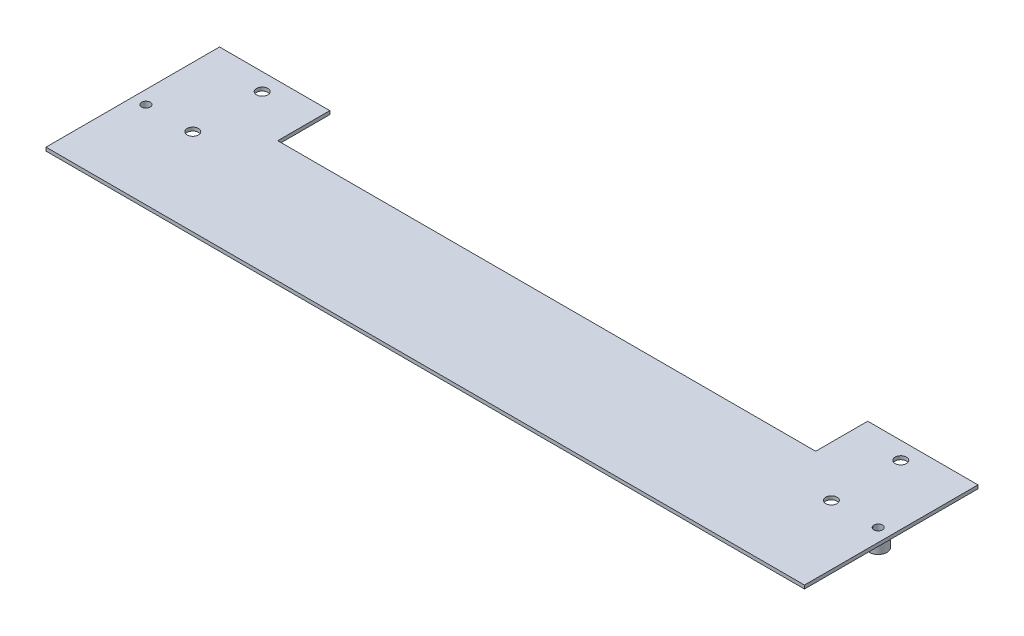
ISO-10303-21;
HEADER;
FILE_DESCRIPTION(('STEP AP214'),'2;1');
FILE_NAME('part.step','',(''),(''),'','','');
FILE_SCHEMA(('AUTOMOTIVE_DESIGN { 1 0 10303 214 1 1 1 1 }'));
ENDSEC;
DATA;
#1=APPLICATION_CONTEXT('core data for automotive mechanical design processes');
#2=APPLICATION_PROTOCOL_DEFINITION('international standard','automotive_design',2000,#1);
#3=PRODUCT_CONTEXT('',#1,'mechanical');
#4=PRODUCT('Part','Part','',(#3));
#5=PRODUCT_RELATED_PRODUCT_CATEGORY('part','',(#4));
#6=PRODUCT_DEFINITION_FORMATION('','',#4);
#7=PRODUCT_DEFINITION_CONTEXT('part definition',#1,'design');
#8=PRODUCT_DEFINITION('design','',#6,#7);
#9=PRODUCT_DEFINITION_SHAPE('','',#8);
#10=(LENGTH_UNIT() NAMED_UNIT(*) SI_UNIT(.MILLI.,.METRE.));
#11=(NAMED_UNIT(*) PLANE_ANGLE_UNIT() SI_UNIT($,.RADIAN.));
#12=(NAMED_UNIT(*) SI_UNIT($,.STERADIAN.) SOLID_ANGLE_UNIT());
#13=UNCERTAINTY_MEASURE_WITH_UNIT(LENGTH_MEASURE(1.E-05),#10,'distance_accuracy_value','');
#14=(GEOMETRIC_REPRESENTATION_CONTEXT(3) GLOBAL_UNCERTAINTY_ASSIGNED_CONTEXT((#13)) GLOBAL_UNIT_ASSIGNED_CONTEXT((#10,
#11,#12)) REPRESENTATION_CONTEXT('',''));
#15=CARTESIAN_POINT('',(0.,0.,0.));
#16=DIRECTION('',(0.,0.,1.));
#17=DIRECTION('',(1.,0.,0.));
#18=AXIS2_PLACEMENT_3D('',#15,#16,#17);
#19=CARTESIAN_POINT('',(193.5,2.,-50.));
#20=DIRECTION('',(0.,0.,1.));
#21=DIRECTION('',(1.,0.,0.));
#22=AXIS2_PLACEMENT_3D('',#19,#20,#21);
#23=PLANE('',#22);
#24=DIRECTION('',(0.,1.,0.));
#25=VECTOR('',#24,1.);
#26=CARTESIAN_POINT('',(-130.05,-16.9688637063127,-50.));
#27=LINE('',#26,#25);
#28=CARTESIAN_POINT('',(-130.05,0.,-50.));
#29=VERTEX_POINT('',#28);
#30=CARTESIAN_POINT('',(-130.05,2.,-50.));
#31=VERTEX_POINT('',#30);
#32=EDGE_CURVE('E164',#29,#31,#27,.T.);
#33=ORIENTED_EDGE('',*,*,#32,.F.);
#34=DIRECTION('',(-1.,0.,0.));
#35=VECTOR('',#34,1.);
#36=CARTESIAN_POINT('',(193.5,0.,-50.));
#37=LINE('',#36,#35);
#38=CARTESIAN_POINT('',(-193.6,0.,-50.));
#39=VERTEX_POINT('',#38);
#40=EDGE_CURVE('E154',#29,#39,#37,.T.);
#41=ORIENTED_EDGE('',*,*,#40,.T.);
#42=DIRECTION('',(0.,-1.,0.));
#43=VECTOR('',#42,1.);
#44=CARTESIAN_POINT('',(-193.6,2.,-50.));
#45=LINE('',#44,#43);
#46=CARTESIAN_POINT('',(-193.6,2.,-50.));
#47=VERTEX_POINT('',#46);
#48=EDGE_CURVE('E187',#47,#39,#45,.T.);
#49=ORIENTED_EDGE('',*,*,#48,.F.);
#50=DIRECTION('',(-1.,0.,0.));
#51=VECTOR('',#50,1.);
#52=CARTESIAN_POINT('',(193.5,2.,-50.));
#53=LINE('',#52,#51);
#54=EDGE_CURVE('E144',#31,#47,#53,.T.);
#55=ORIENTED_EDGE('',*,*,#54,.F.);
#56=EDGE_LOOP('',(#33,#41,#49,#55));
#57=FACE_BOUND('',#56,.T.);
#58=ADVANCED_FACE('F20',(#57),#23,.F.);
#59=CARTESIAN_POINT('',(0.,2.,0.));
#60=DIRECTION('',(0.,1.,0.));
#61=DIRECTION('',(0.,0.,1.));
#62=AXIS2_PLACEMENT_3D('',#59,#60,#61);
#63=PLANE('',#62);
#64=CARTESIAN_POINT('',(236.,2.,0.));
#65=DIRECTION('',(0.,1.,0.));
#66=DIRECTION('',(0.,0.,1.));
#67=AXIS2_PLACEMENT_3D('',#64,#65,#66);
#68=CIRCLE('',#67,2.4585);
#69=CARTESIAN_POINT('',(236.,2.,2.45849999999999));
#70=VERTEX_POINT('',#69);
#71=EDGE_CURVE('E114',#70,#70,#68,.F.);
#72=ORIENTED_EDGE('',*,*,#71,.T.);
#73=EDGE_LOOP('',(#72));
#74=FACE_BOUND('',#73,.T.);
#75=CARTESIAN_POINT('',(-186.008483751727,2.,0.));
#76=DIRECTION('',(0.,1.,0.));
#77=DIRECTION('',(0.,0.,1.));
#78=AXIS2_PLACEMENT_3D('',#75,#76,#77);
#79=CIRCLE('',#78,2.4585);
#80=CARTESIAN_POINT('',(-186.008483751727,2.,2.45849999999999));
#81=VERTEX_POINT('',#80);
#82=EDGE_CURVE('E163',#81,#81,#79,.F.);
#83=ORIENTED_EDGE('',*,*,#82,.T.);
#84=EDGE_LOOP('',(#83));
#85=FACE_BOUND('',#84,.T.);
#86=CARTESIAN_POINT('',(209.,2.,0.));
#87=DIRECTION('',(0.,-1.,0.));
#88=DIRECTION('',(-1.,0.,0.));
#89=AXIS2_PLACEMENT_3D('',#86,#87,#88);
#90=CIRCLE('',#89,3.25);
#91=CARTESIAN_POINT('',(205.75,2.,0.));
#92=VERTEX_POINT('',#91);
#93=EDGE_CURVE('E166',#92,#92,#90,.T.);
#94=ORIENTED_EDGE('',*,*,#93,.T.);
#95=EDGE_LOOP('',(#94));
#96=FACE_BOUND('',#95,.T.);
#97=CARTESIAN_POINT('',(209.,2.,-40.));
#98=DIRECTION('',(0.,-1.,0.));
#99=DIRECTION('',(-1.,0.,0.));
#100=AXIS2_PLACEMENT_3D('',#97,#98,#99);
#101=CIRCLE('',#100,3.25);
#102=CARTESIAN_POINT('',(205.75,2.,-40.));
#103=VERTEX_POINT('',#102);
#104=EDGE_CURVE('E205',#103,#103,#101,.T.);
#105=ORIENTED_EDGE('',*,*,#104,.T.);
#106=EDGE_LOOP('',(#105));
#107=FACE_BOUND('',#106,.T.);
#108=CARTESIAN_POINT('',(-159.008483751727,2.,0.));
#109=DIRECTION('',(0.,-1.,0.));
#110=DIRECTION('',(-1.,0.,0.));
#111=AXIS2_PLACEMENT_3D('',#108,#109,#110);
#112=CIRCLE('',#111,3.25);
#113=CARTESIAN_POINT('',(-162.258483751727,2.,0.));
#114=VERTEX_POINT('',#113);
#115=EDGE_CURVE('E178',#114,#114,#112,.T.);
#116=ORIENTED_EDGE('',*,*,#115,.T.);
#117=EDGE_LOOP('',(#116));
#118=FACE_BOUND('',#117,.T.);
#119=CARTESIAN_POINT('',(-159.008483751727,2.,-40.));
#120=DIRECTION('',(0.,-1.,0.));
#121=DIRECTION('',(1.,0.,0.));
#122=AXIS2_PLACEMENT_3D('',#119,#120,#121);
#123=CIRCLE('',#122,3.25);
#124=CARTESIAN_POINT('',(-155.758483751727,2.,-40.));
#125=VERTEX_POINT('',#124);
#126=EDGE_CURVE('E171',#125,#125,#123,.T.);
#127=ORIENTED_EDGE('',*,*,#126,.T.);
#128=EDGE_LOOP('',(#127));
#129=FACE_BOUND('',#128,.T.);
#130=DIRECTION('',(-1.,0.,0.));
#131=VECTOR('',#130,1.);
#132=CARTESIAN_POINT('',(-100.05,2.,-20.));
#133=LINE('',#132,#131);
#134=CARTESIAN_POINT('',(179.95,2.,-20.));
#135=VERTEX_POINT('',#134);
#136=CARTESIAN_POINT('',(-130.05,2.,-20.));
#137=VERTEX_POINT('',#136);
#138=EDGE_CURVE('E95',#135,#137,#133,.T.);
#139=ORIENTED_EDGE('',*,*,#138,.T.);
#140=DIRECTION('',(0.,0.,-1.));
#141=VECTOR('',#140,1.);
#142=CARTESIAN_POINT('',(-130.05,2.,-50.));
#143=LINE('',#142,#141);
#144=EDGE_CURVE('E101',#137,#31,#143,.T.);
#145=ORIENTED_EDGE('',*,*,#144,.T.);
#146=ORIENTED_EDGE('',*,*,#54,.T.);
#147=DIRECTION('',(0.,0.,1.));
#148=VECTOR('',#147,1.);
#149=CARTESIAN_POINT('',(-193.6,2.,-50.));
#150=LINE('',#149,#148);
#151=CARTESIAN_POINT('',(-193.6,2.,50.));
#152=VERTEX_POINT('',#151);
#153=EDGE_CURVE('E143',#47,#152,#150,.T.);
#154=ORIENTED_EDGE('',*,*,#153,.T.);
#155=DIRECTION('',(1.,0.,0.));
#156=VECTOR('',#155,1.);
#157=CARTESIAN_POINT('',(-193.5,2.,50.));
#158=LINE('',#157,#156);
#159=CARTESIAN_POINT('',(243.5,2.,50.));
#160=VERTEX_POINT('',#159);
#161=EDGE_CURVE('E145',#152,#160,#158,.T.);
#162=ORIENTED_EDGE('',*,*,#161,.T.);
#163=DIRECTION('',(0.,0.,-1.));
#164=VECTOR('',#163,1.);
#165=CARTESIAN_POINT('',(243.5,2.,50.));
#166=LINE('',#165,#164);
#167=CARTESIAN_POINT('',(243.5,2.,-50.));
#168=VERTEX_POINT('',#167);
#169=EDGE_CURVE('E148',#160,#168,#166,.T.);
#170=ORIENTED_EDGE('',*,*,#169,.T.);
#171=CARTESIAN_POINT('',(179.95,2.,-50.));
#172=VERTEX_POINT('',#171);
#173=EDGE_CURVE('E106',#168,#172,#53,.T.);
#174=ORIENTED_EDGE('',*,*,#173,.T.);
#175=DIRECTION('',(0.,0.,1.));
#176=VECTOR('',#175,1.);
#177=CARTESIAN_POINT('',(179.95,2.,-30.));
#178=LINE('',#177,#176);
#179=EDGE_CURVE('E85',#172,#135,#178,.T.);
#180=ORIENTED_EDGE('',*,*,#179,.T.);
#181=EDGE_LOOP('',(#139,#145,#146,#154,#162,#170,#174,#180));
#182=FACE_BOUND('',#181,.T.);
#183=ADVANCED_FACE('F104',(#74,#85,#96,#107,#118,#129,#182),#63,.T.);
#184=CARTESIAN_POINT('',(0.,0.,0.));
#185=DIRECTION('',(0.,1.,0.));
#186=DIRECTION('',(0.,0.,1.));
#187=AXIS2_PLACEMENT_3D('',#184,#185,#186);
#188=PLANE('',#187);
#189=CARTESIAN_POINT('',(236.,0.,0.));
#190=DIRECTION('',(0.,1.,0.));
#191=DIRECTION('',(-1.,0.,0.));
#192=AXIS2_PLACEMENT_3D('',#189,#190,#191);
#193=CIRCLE('',#192,5.);
#194=CARTESIAN_POINT('',(231.,0.,0.));
#195=VERTEX_POINT('',#194);
#196=EDGE_CURVE('E122',#195,#195,#193,.T.);
#197=ORIENTED_EDGE('',*,*,#196,.T.);
#198=EDGE_LOOP('',(#197));
#199=FACE_BOUND('',#198,.T.);
#200=CARTESIAN_POINT('',(-186.008483751727,0.,0.));
#201=DIRECTION('',(0.,1.,0.));
#202=DIRECTION('',(-1.,0.,0.));
#203=AXIS2_PLACEMENT_3D('',#200,#201,#202);
#204=CIRCLE('',#203,5.);
#205=CARTESIAN_POINT('',(-191.008483751727,0.,0.));
#206=VERTEX_POINT('',#205);
#207=EDGE_CURVE('E133',#206,#206,#204,.T.);
#208=ORIENTED_EDGE('',*,*,#207,.T.);
#209=EDGE_LOOP('',(#208));
#210=FACE_BOUND('',#209,.T.);
#211=CARTESIAN_POINT('',(-159.008483751727,0.,-40.));
#212=DIRECTION('',(0.,1.,0.));
#213=DIRECTION('',(0.,0.,1.));
#214=AXIS2_PLACEMENT_3D('',#211,#212,#213);
#215=CIRCLE('',#214,3.25);
#216=CARTESIAN_POINT('',(-159.008483751727,0.,-36.75));
#217=VERTEX_POINT('',#216);
#218=EDGE_CURVE('E159',#217,#217,#215,.F.);
#219=ORIENTED_EDGE('',*,*,#218,.F.);
#220=EDGE_LOOP('',(#219));
#221=FACE_BOUND('',#220,.T.);
#222=CARTESIAN_POINT('',(-159.008483751727,0.,0.));
#223=DIRECTION('',(0.,1.,0.));
#224=DIRECTION('',(0.,0.,1.));
#225=AXIS2_PLACEMENT_3D('',#222,#223,#224);
#226=CIRCLE('',#225,3.25);
#227=CARTESIAN_POINT('',(-159.008483751727,0.,3.24999999999996));
#228=VERTEX_POINT('',#227);
#229=EDGE_CURVE('E175',#228,#228,#226,.F.);
#230=ORIENTED_EDGE('',*,*,#229,.F.);
#231=EDGE_LOOP('',(#230));
#232=FACE_BOUND('',#231,.T.);
#233=CARTESIAN_POINT('',(209.,0.,-40.));
#234=DIRECTION('',(0.,1.,0.));
#235=DIRECTION('',(0.,0.,1.));
#236=AXIS2_PLACEMENT_3D('',#233,#234,#235);
#237=CIRCLE('',#236,3.25);
#238=CARTESIAN_POINT('',(209.,0.,-36.75));
#239=VERTEX_POINT('',#238);
#240=EDGE_CURVE('E182',#239,#239,#237,.F.);
#241=ORIENTED_EDGE('',*,*,#240,.F.);
#242=EDGE_LOOP('',(#241));
#243=FACE_BOUND('',#242,.T.);
#244=CARTESIAN_POINT('',(209.,0.,0.));
#245=DIRECTION('',(0.,1.,0.));
#246=DIRECTION('',(0.,0.,1.));
#247=AXIS2_PLACEMENT_3D('',#244,#245,#246);
#248=CIRCLE('',#247,3.25);
#249=CARTESIAN_POINT('',(209.,0.,3.24999999999999));
#250=VERTEX_POINT('',#249);
#251=EDGE_CURVE('E209',#250,#250,#248,.F.);
#252=ORIENTED_EDGE('',*,*,#251,.F.);
#253=EDGE_LOOP('',(#252));
#254=FACE_BOUND('',#253,.T.);
#255=DIRECTION('',(0.,0.,-1.));
#256=VECTOR('',#255,1.);
#257=CARTESIAN_POINT('',(-130.05,0.,0.));
#258=LINE('',#257,#256);
#259=CARTESIAN_POINT('',(-130.05,0.,-20.));
#260=VERTEX_POINT('',#259);
#261=EDGE_CURVE('E12',#260,#29,#258,.T.);
#262=ORIENTED_EDGE('',*,*,#261,.F.);
#263=DIRECTION('',(-1.,0.,0.));
#264=VECTOR('',#263,1.);
#265=CARTESIAN_POINT('',(0.,0.,-20.));
#266=LINE('',#265,#264);
#267=CARTESIAN_POINT('',(179.95,0.,-20.));
#268=VERTEX_POINT('',#267);
#269=EDGE_CURVE('E30',#268,#260,#266,.T.);
#270=ORIENTED_EDGE('',*,*,#269,.F.);
#271=DIRECTION('',(0.,0.,1.));
#272=VECTOR('',#271,1.);
#273=CARTESIAN_POINT('',(179.95,0.,0.));
#274=LINE('',#273,#272);
#275=CARTESIAN_POINT('',(179.95,0.,-50.));
#276=VERTEX_POINT('',#275);
#277=EDGE_CURVE('E88',#276,#268,#274,.T.);
#278=ORIENTED_EDGE('',*,*,#277,.F.);
#279=CARTESIAN_POINT('',(243.5,0.,-50.));
#280=VERTEX_POINT('',#279);
#281=EDGE_CURVE('E150',#280,#276,#37,.T.);
#282=ORIENTED_EDGE('',*,*,#281,.F.);
#283=DIRECTION('',(0.,0.,-1.));
#284=VECTOR('',#283,1.);
#285=CARTESIAN_POINT('',(243.5,0.,50.));
#286=LINE('',#285,#284);
#287=CARTESIAN_POINT('',(243.5,0.,50.));
#288=VERTEX_POINT('',#287);
#289=EDGE_CURVE('E158',#288,#280,#286,.T.);
#290=ORIENTED_EDGE('',*,*,#289,.F.);
#291=DIRECTION('',(1.,0.,0.));
#292=VECTOR('',#291,1.);
#293=CARTESIAN_POINT('',(-193.5,0.,50.));
#294=LINE('',#293,#292);
#295=CARTESIAN_POINT('',(-193.6,0.,50.));
#296=VERTEX_POINT('',#295);
#297=EDGE_CURVE('E155',#296,#288,#294,.T.);
#298=ORIENTED_EDGE('',*,*,#297,.F.);
#299=DIRECTION('',(0.,0.,1.));
#300=VECTOR('',#299,1.);
#301=CARTESIAN_POINT('',(-193.6,0.,-50.));
#302=LINE('',#301,#300);
#303=EDGE_CURVE('E149',#39,#296,#302,.T.);
#304=ORIENTED_EDGE('',*,*,#303,.F.);
#305=ORIENTED_EDGE('',*,*,#40,.F.);
#306=EDGE_LOOP('',(#262,#270,#278,#282,#290,#298,#304,#305));
#307=FACE_BOUND('',#306,.T.);
#308=ADVANCED_FACE('F220',(#199,#210,#221,#232,#243,#254,#307),#188,.F.);
#309=CARTESIAN_POINT('',(-193.6,2.,-50.));
#310=DIRECTION('',(1.,0.,0.));
#311=DIRECTION('',(0.,0.,-1.));
#312=AXIS2_PLACEMENT_3D('',#309,#310,#311);
#313=PLANE('',#312);
#314=ORIENTED_EDGE('',*,*,#303,.T.);
#315=DIRECTION('',(0.,-1.,0.));
#316=VECTOR('',#315,1.);
#317=CARTESIAN_POINT('',(-193.6,2.,50.));
#318=LINE('',#317,#316);
#319=EDGE_CURVE('E191',#152,#296,#318,.T.);
#320=ORIENTED_EDGE('',*,*,#319,.F.);
#321=ORIENTED_EDGE('',*,*,#153,.F.);
#322=ORIENTED_EDGE('',*,*,#48,.T.);
#323=EDGE_LOOP('',(#314,#320,#321,#322));
#324=FACE_BOUND('',#323,.T.);
#325=ADVANCED_FACE('F223',(#324),#313,.F.);
#326=ORIENTED_EDGE('',*,*,#281,.T.);
#327=DIRECTION('',(0.,1.,0.));
#328=VECTOR('',#327,1.);
#329=CARTESIAN_POINT('',(179.95,-16.9688637063127,-50.));
#330=LINE('',#329,#328);
#331=EDGE_CURVE('E92',#276,#172,#330,.T.);
#332=ORIENTED_EDGE('',*,*,#331,.T.);
#333=ORIENTED_EDGE('',*,*,#173,.F.);
#334=DIRECTION('',(0.,-1.,0.));
#335=VECTOR('',#334,1.);
#336=CARTESIAN_POINT('',(243.5,2.,-50.));
#337=LINE('',#336,#335);
#338=EDGE_CURVE('E190',#168,#280,#337,.T.);
#339=ORIENTED_EDGE('',*,*,#338,.T.);
#340=EDGE_LOOP('',(#326,#332,#333,#339));
#341=FACE_BOUND('',#340,.T.);
#342=ADVANCED_FACE('F266',(#341),#23,.F.);
#343=CARTESIAN_POINT('',(243.5,2.,50.));
#344=DIRECTION('',(-1.,0.,0.));
#345=DIRECTION('',(0.,0.,1.));
#346=AXIS2_PLACEMENT_3D('',#343,#344,#345);
#347=PLANE('',#346);
#348=ORIENTED_EDGE('',*,*,#289,.T.);
#349=ORIENTED_EDGE('',*,*,#338,.F.);
#350=ORIENTED_EDGE('',*,*,#169,.F.);
#351=DIRECTION('',(0.,-1.,0.));
#352=VECTOR('',#351,1.);
#353=CARTESIAN_POINT('',(243.5,2.,50.));
#354=LINE('',#353,#352);
#355=EDGE_CURVE('E199',#160,#288,#354,.T.);
#356=ORIENTED_EDGE('',*,*,#355,.T.);
#357=EDGE_LOOP('',(#348,#349,#350,#356));
#358=FACE_BOUND('',#357,.T.);
#359=ADVANCED_FACE('F272',(#358),#347,.F.);
#360=CARTESIAN_POINT('',(-193.5,2.,50.));
#361=DIRECTION('',(0.,0.,-1.));
#362=DIRECTION('',(-1.,0.,0.));
#363=AXIS2_PLACEMENT_3D('',#360,#361,#362);
#364=PLANE('',#363);
#365=ORIENTED_EDGE('',*,*,#297,.T.);
#366=ORIENTED_EDGE('',*,*,#355,.F.);
#367=ORIENTED_EDGE('',*,*,#161,.F.);
#368=ORIENTED_EDGE('',*,*,#319,.T.);
#369=EDGE_LOOP('',(#365,#366,#367,#368));
#370=FACE_BOUND('',#369,.T.);
#371=ADVANCED_FACE('F278',(#370),#364,.F.);
#372=CARTESIAN_POINT('',(-159.008483751727,-58.0429432254209,-40.));
#373=DIRECTION('',(0.,1.,0.));
#374=DIRECTION('',(0.,0.,1.));
#375=AXIS2_PLACEMENT_3D('',#372,#373,#374);
#376=CYLINDRICAL_SURFACE('',#375,3.25);
#377=ORIENTED_EDGE('',*,*,#126,.F.);
#378=EDGE_LOOP('',(#377));
#379=FACE_BOUND('',#378,.T.);
#380=ORIENTED_EDGE('',*,*,#218,.T.);
#381=EDGE_LOOP('',(#380));
#382=FACE_BOUND('',#381,.T.);
#383=ADVANCED_FACE('F286',(#379,#382),#376,.F.);
#384=CARTESIAN_POINT('',(-159.008483751727,-58.0429432254209,0.));
#385=DIRECTION('',(0.,1.,0.));
#386=DIRECTION('',(0.,0.,1.));
#387=AXIS2_PLACEMENT_3D('',#384,#385,#386);
#388=CYLINDRICAL_SURFACE('',#387,3.25);
#389=ORIENTED_EDGE('',*,*,#115,.F.);
#390=EDGE_LOOP('',(#389));
#391=FACE_BOUND('',#390,.T.);
#392=ORIENTED_EDGE('',*,*,#229,.T.);
#393=EDGE_LOOP('',(#392));
#394=FACE_BOUND('',#393,.T.);
#395=ADVANCED_FACE('F290',(#391,#394),#388,.F.);
#396=CARTESIAN_POINT('',(209.,-7.18446300888712,-40.));
#397=DIRECTION('',(0.,1.,0.));
#398=DIRECTION('',(0.,0.,1.));
#399=AXIS2_PLACEMENT_3D('',#396,#397,#398);
#400=CYLINDRICAL_SURFACE('',#399,3.25);
#401=ORIENTED_EDGE('',*,*,#104,.F.);
#402=EDGE_LOOP('',(#401));
#403=FACE_BOUND('',#402,.T.);
#404=ORIENTED_EDGE('',*,*,#240,.T.);
#405=EDGE_LOOP('',(#404));
#406=FACE_BOUND('',#405,.T.);
#407=ADVANCED_FACE('F259',(#403,#406),#400,.F.);
#408=CARTESIAN_POINT('',(209.,-7.18446300888712,0.));
#409=DIRECTION('',(0.,1.,0.));
#410=DIRECTION('',(0.,0.,1.));
#411=AXIS2_PLACEMENT_3D('',#408,#409,#410);
#412=CYLINDRICAL_SURFACE('',#411,3.25);
#413=ORIENTED_EDGE('',*,*,#93,.F.);
#414=EDGE_LOOP('',(#413));
#415=FACE_BOUND('',#414,.T.);
#416=ORIENTED_EDGE('',*,*,#251,.T.);
#417=EDGE_LOOP('',(#416));
#418=FACE_BOUND('',#417,.T.);
#419=ADVANCED_FACE('F218',(#415,#418),#412,.F.);
#420=CARTESIAN_POINT('',(-130.05,-16.9688637063127,-50.));
#421=DIRECTION('',(1.,0.,0.));
#422=DIRECTION('',(0.,0.,-1.));
#423=AXIS2_PLACEMENT_3D('',#420,#421,#422);
#424=PLANE('',#423);
#425=ORIENTED_EDGE('',*,*,#261,.T.);
#426=ORIENTED_EDGE('',*,*,#32,.T.);
#427=ORIENTED_EDGE('',*,*,#144,.F.);
#428=DIRECTION('',(0.,1.,0.));
#429=VECTOR('',#428,1.);
#430=CARTESIAN_POINT('',(-130.05,-16.9688637063127,-20.));
#431=LINE('',#430,#429);
#432=EDGE_CURVE('E91',#260,#137,#431,.T.);
#433=ORIENTED_EDGE('',*,*,#432,.F.);
#434=EDGE_LOOP('',(#425,#426,#427,#433));
#435=FACE_BOUND('',#434,.T.);
#436=ADVANCED_FACE('F250',(#435),#424,.T.);
#437=CARTESIAN_POINT('',(-100.05,-16.9688637063127,-20.));
#438=DIRECTION('',(0.,0.,-1.));
#439=DIRECTION('',(-1.,0.,0.));
#440=AXIS2_PLACEMENT_3D('',#437,#438,#439);
#441=PLANE('',#440);
#442=ORIENTED_EDGE('',*,*,#269,.T.);
#443=ORIENTED_EDGE('',*,*,#432,.T.);
#444=ORIENTED_EDGE('',*,*,#138,.F.);
#445=DIRECTION('',(0.,1.,0.));
#446=VECTOR('',#445,1.);
#447=CARTESIAN_POINT('',(179.95,-16.9688637063127,-20.));
#448=LINE('',#447,#446);
#449=EDGE_CURVE('E81',#268,#135,#448,.T.);
#450=ORIENTED_EDGE('',*,*,#449,.F.);
#451=EDGE_LOOP('',(#442,#443,#444,#450));
#452=FACE_BOUND('',#451,.T.);
#453=ADVANCED_FACE('F96',(#452),#441,.T.);
#454=CARTESIAN_POINT('',(179.95,-16.9688637063127,-30.));
#455=DIRECTION('',(-1.,0.,0.));
#456=DIRECTION('',(0.,0.,1.));
#457=AXIS2_PLACEMENT_3D('',#454,#455,#456);
#458=PLANE('',#457);
#459=ORIENTED_EDGE('',*,*,#277,.T.);
#460=ORIENTED_EDGE('',*,*,#449,.T.);
#461=ORIENTED_EDGE('',*,*,#179,.F.);
#462=ORIENTED_EDGE('',*,*,#331,.F.);
#463=EDGE_LOOP('',(#459,#460,#461,#462));
#464=FACE_BOUND('',#463,.T.);
#465=ADVANCED_FACE('F83',(#464),#458,.T.);
#466=CARTESIAN_POINT('',(-186.008483751727,-27.4642192717884,0.));
#467=DIRECTION('',(0.,1.,0.));
#468=DIRECTION('',(0.,0.,1.));
#469=AXIS2_PLACEMENT_3D('',#466,#467,#468);
#470=CYLINDRICAL_SURFACE('',#469,2.4585);
#471=ORIENTED_EDGE('',*,*,#82,.F.);
#472=EDGE_LOOP('',(#471));
#473=FACE_BOUND('',#472,.T.);
#474=CARTESIAN_POINT('',(-186.008483751727,-8.,0.));
#475=DIRECTION('',(0.,1.,0.));
#476=DIRECTION('',(0.,0.,1.));
#477=AXIS2_PLACEMENT_3D('',#474,#475,#476);
#478=CIRCLE('',#477,2.4585);
#479=CARTESIAN_POINT('',(-186.008483751727,-8.,2.45849999999999));
#480=VERTEX_POINT('',#479);
#481=EDGE_CURVE('E139',#480,#480,#478,.F.);
#482=ORIENTED_EDGE('',*,*,#481,.T.);
#483=EDGE_LOOP('',(#482));
#484=FACE_BOUND('',#483,.T.);
#485=ADVANCED_FACE('F300',(#473,#484),#470,.F.);
#486=CARTESIAN_POINT('',(-186.008483751727,-8.,0.));
#487=DIRECTION('',(0.,1.,0.));
#488=DIRECTION('',(0.,0.,1.));
#489=AXIS2_PLACEMENT_3D('',#486,#487,#488);
#490=CYLINDRICAL_SURFACE('',#489,5.);
#491=CARTESIAN_POINT('',(-186.008483751727,-8.,0.));
#492=DIRECTION('',(0.,1.,0.));
#493=DIRECTION('',(-1.,0.,0.));
#494=AXIS2_PLACEMENT_3D('',#491,#492,#493);
#495=CIRCLE('',#494,5.);
#496=CARTESIAN_POINT('',(-191.008483751727,-8.,0.));
#497=VERTEX_POINT('',#496);
#498=EDGE_CURVE('E136',#497,#497,#495,.T.);
#499=ORIENTED_EDGE('',*,*,#498,.T.);
#500=EDGE_LOOP('',(#499));
#501=FACE_BOUND('',#500,.T.);
#502=ORIENTED_EDGE('',*,*,#207,.F.);
#503=EDGE_LOOP('',(#502));
#504=FACE_BOUND('',#503,.T.);
#505=ADVANCED_FACE('F309',(#501,#504),#490,.T.);
#506=CARTESIAN_POINT('',(-186.008483751727,-8.,0.));
#507=DIRECTION('',(0.,1.,0.));
#508=DIRECTION('',(0.,0.,1.));
#509=AXIS2_PLACEMENT_3D('',#506,#507,#508);
#510=PLANE('',#509);
#511=ORIENTED_EDGE('',*,*,#481,.F.);
#512=EDGE_LOOP('',(#511));
#513=FACE_BOUND('',#512,.T.);
#514=ORIENTED_EDGE('',*,*,#498,.F.);
#515=EDGE_LOOP('',(#514));
#516=FACE_BOUND('',#515,.T.);
#517=ADVANCED_FACE('F316',(#513,#516),#510,.F.);
#518=CARTESIAN_POINT('',(236.,-8.,0.));
#519=DIRECTION('',(0.,1.,0.));
#520=DIRECTION('',(0.,0.,1.));
#521=AXIS2_PLACEMENT_3D('',#518,#519,#520);
#522=CYLINDRICAL_SURFACE('',#521,5.);
#523=CARTESIAN_POINT('',(236.,-8.,0.));
#524=DIRECTION('',(0.,1.,0.));
#525=DIRECTION('',(-1.,0.,0.));
#526=AXIS2_PLACEMENT_3D('',#523,#524,#525);
#527=CIRCLE('',#526,5.);
#528=CARTESIAN_POINT('',(231.,-8.,0.));
#529=VERTEX_POINT('',#528);
#530=EDGE_CURVE('E126',#529,#529,#527,.T.);
#531=ORIENTED_EDGE('',*,*,#530,.T.);
#532=EDGE_LOOP('',(#531));
#533=FACE_BOUND('',#532,.T.);
#534=ORIENTED_EDGE('',*,*,#196,.F.);
#535=EDGE_LOOP('',(#534));
#536=FACE_BOUND('',#535,.T.);
#537=ADVANCED_FACE('F325',(#533,#536),#522,.T.);
#538=CARTESIAN_POINT('',(236.,-8.,0.));
#539=DIRECTION('',(0.,1.,0.));
#540=DIRECTION('',(0.,0.,1.));
#541=AXIS2_PLACEMENT_3D('',#538,#539,#540);
#542=PLANE('',#541);
#543=CARTESIAN_POINT('',(236.,-8.,0.));
#544=DIRECTION('',(0.,1.,0.));
#545=DIRECTION('',(0.,0.,1.));
#546=AXIS2_PLACEMENT_3D('',#543,#544,#545);
#547=CIRCLE('',#546,2.4585);
#548=CARTESIAN_POINT('',(236.,-8.,2.45849999999999));
#549=VERTEX_POINT('',#548);
#550=EDGE_CURVE('E24',#549,#549,#547,.F.);
#551=ORIENTED_EDGE('',*,*,#550,.F.);
#552=EDGE_LOOP('',(#551));
#553=FACE_BOUND('',#552,.T.);
#554=ORIENTED_EDGE('',*,*,#530,.F.);
#555=EDGE_LOOP('',(#554));
#556=FACE_BOUND('',#555,.T.);
#557=ADVANCED_FACE('F342',(#553,#556),#542,.F.);
#558=CARTESIAN_POINT('',(236.,-18.7854048442561,0.));
#559=DIRECTION('',(0.,1.,0.));
#560=DIRECTION('',(0.,0.,1.));
#561=AXIS2_PLACEMENT_3D('',#558,#559,#560);
#562=CYLINDRICAL_SURFACE('',#561,2.4585);
#563=ORIENTED_EDGE('',*,*,#71,.F.);
#564=EDGE_LOOP('',(#563));
#565=FACE_BOUND('',#564,.T.);
#566=ORIENTED_EDGE('',*,*,#550,.T.);
#567=EDGE_LOOP('',(#566));
#568=FACE_BOUND('',#567,.T.);
#569=ADVANCED_FACE('F22',(#565,#568),#562,.F.);
#570=CLOSED_SHELL('',(#58,#183,#308,#325,#342,#359,#371,#383,#395,#407,#419,#436,#453,#465,#485,
#505,#517,#537,#557,#569));
#571=MANIFOLD_SOLID_BREP('B1',#570);
#572=ADVANCED_BREP_SHAPE_REPRESENTATION('',(#18,#571),#14);
#573=SHAPE_DEFINITION_REPRESENTATION(#9,#572);
ENDSEC;
END-ISO-10303-21;
